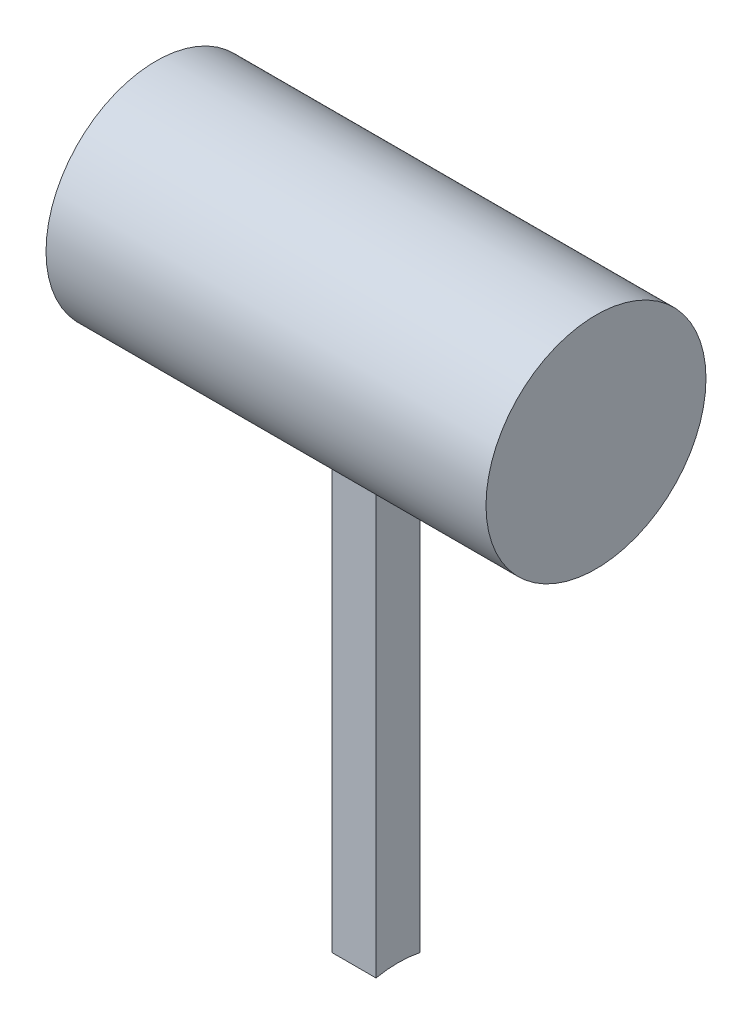
ISO-10303-21;
HEADER;
FILE_DESCRIPTION(('STEP AP214'),'2;1');
FILE_NAME('part.step','',(''),(''),'','','');
FILE_SCHEMA(('AUTOMOTIVE_DESIGN { 1 0 10303 214 1 1 1 1 }'));
ENDSEC;
DATA;
#1=APPLICATION_CONTEXT('core data for automotive mechanical design processes');
#2=APPLICATION_PROTOCOL_DEFINITION('international standard','automotive_design',2000,#1);
#3=PRODUCT_CONTEXT('',#1,'mechanical');
#4=PRODUCT('Part','Part','',(#3));
#5=PRODUCT_RELATED_PRODUCT_CATEGORY('part','',(#4));
#6=PRODUCT_DEFINITION_FORMATION('','',#4);
#7=PRODUCT_DEFINITION_CONTEXT('part definition',#1,'design');
#8=PRODUCT_DEFINITION('design','',#6,#7);
#9=PRODUCT_DEFINITION_SHAPE('','',#8);
#10=(LENGTH_UNIT() NAMED_UNIT(*) SI_UNIT(.MILLI.,.METRE.));
#11=(NAMED_UNIT(*) PLANE_ANGLE_UNIT() SI_UNIT($,.RADIAN.));
#12=(NAMED_UNIT(*) SI_UNIT($,.STERADIAN.) SOLID_ANGLE_UNIT());
#13=UNCERTAINTY_MEASURE_WITH_UNIT(LENGTH_MEASURE(1.E-05),#10,'distance_accuracy_value','');
#14=(GEOMETRIC_REPRESENTATION_CONTEXT(3) GLOBAL_UNCERTAINTY_ASSIGNED_CONTEXT((#13)) GLOBAL_UNIT_ASSIGNED_CONTEXT((#10,
#11,#12)) REPRESENTATION_CONTEXT('',''));
#15=CARTESIAN_POINT('',(0.,0.,0.));
#16=DIRECTION('',(0.,0.,1.));
#17=DIRECTION('',(1.,0.,0.));
#18=AXIS2_PLACEMENT_3D('',#15,#16,#17);
#19=CARTESIAN_POINT('',(10.,0.,0.));
#20=DIRECTION('',(-1.,0.,0.));
#21=DIRECTION('',(0.,0.,1.));
#22=AXIS2_PLACEMENT_3D('',#19,#20,#21);
#23=CYLINDRICAL_SURFACE('',#22,5.);
#24=CARTESIAN_POINT('',(-0.999999999999999,0.,0.));
#25=DIRECTION('',(1.,0.,0.));
#26=DIRECTION('',(0.,1.,0.));
#27=AXIS2_PLACEMENT_3D('',#24,#25,#26);
#28=CIRCLE('',#27,5.);
#29=CARTESIAN_POINT('',(-0.999999999999999,-4.89897948556635,1.));
#30=VERTEX_POINT('',#29);
#31=CARTESIAN_POINT('',(-1.,-4.89897948556635,-1.));
#32=VERTEX_POINT('',#31);
#33=EDGE_CURVE('E54',#30,#32,#28,.T.);
#34=ORIENTED_EDGE('',*,*,#33,.F.);
#35=DIRECTION('',(-1.,0.,0.));
#36=VECTOR('',#35,1.);
#37=CARTESIAN_POINT('',(10.,-4.89897948556635,1.));
#38=LINE('',#37,#36);
#39=CARTESIAN_POINT('',(1.,-4.89897948556635,1.));
#40=VERTEX_POINT('',#39);
#41=EDGE_CURVE('E40',#30,#40,#38,.F.);
#42=ORIENTED_EDGE('',*,*,#41,.T.);
#43=CARTESIAN_POINT('',(0.999999999999999,0.,0.));
#44=DIRECTION('',(-1.,0.,0.));
#45=DIRECTION('',(0.,-1.,0.));
#46=AXIS2_PLACEMENT_3D('',#43,#44,#45);
#47=CIRCLE('',#46,5.);
#48=CARTESIAN_POINT('',(1.,-4.89897948556635,-1.));
#49=VERTEX_POINT('',#48);
#50=EDGE_CURVE('E88',#49,#40,#47,.T.);
#51=ORIENTED_EDGE('',*,*,#50,.F.);
#52=DIRECTION('',(-1.,0.,0.));
#53=VECTOR('',#52,1.);
#54=CARTESIAN_POINT('',(10.,-4.89897948556635,-1.));
#55=LINE('',#54,#53);
#56=EDGE_CURVE('E101',#32,#49,#55,.F.);
#57=ORIENTED_EDGE('',*,*,#56,.F.);
#58=EDGE_LOOP('',(#34,#42,#51,#57));
#59=FACE_BOUND('',#58,.T.);
#60=CARTESIAN_POINT('',(10.,0.,0.));
#61=DIRECTION('',(1.,0.,0.));
#62=DIRECTION('',(0.,0.,-1.));
#63=AXIS2_PLACEMENT_3D('',#60,#61,#62);
#64=CIRCLE('',#63,5.);
#65=CARTESIAN_POINT('',(10.,0.,-5.));
#66=VERTEX_POINT('',#65);
#67=EDGE_CURVE('E92',#66,#66,#64,.T.);
#68=ORIENTED_EDGE('',*,*,#67,.F.);
#69=EDGE_LOOP('',(#68));
#70=FACE_BOUND('',#69,.T.);
#71=CARTESIAN_POINT('',(-10.,0.,0.));
#72=DIRECTION('',(1.,0.,0.));
#73=DIRECTION('',(0.,0.,-1.));
#74=AXIS2_PLACEMENT_3D('',#71,#72,#73);
#75=CIRCLE('',#74,5.);
#76=CARTESIAN_POINT('',(-10.,0.,-5.));
#77=VERTEX_POINT('',#76);
#78=EDGE_CURVE('E89',#77,#77,#75,.T.);
#79=ORIENTED_EDGE('',*,*,#78,.T.);
#80=EDGE_LOOP('',(#79));
#81=FACE_BOUND('',#80,.T.);
#82=ADVANCED_FACE('F33',(#59,#70,#81),#23,.T.);
#83=CARTESIAN_POINT('',(10.,0.,0.));
#84=DIRECTION('',(1.,0.,0.));
#85=DIRECTION('',(0.,0.,-1.));
#86=AXIS2_PLACEMENT_3D('',#83,#84,#85);
#87=PLANE('',#86);
#88=ORIENTED_EDGE('',*,*,#67,.T.);
#89=EDGE_LOOP('',(#88));
#90=FACE_BOUND('',#89,.T.);
#91=ADVANCED_FACE('F126',(#90),#87,.T.);
#92=CARTESIAN_POINT('',(-10.,0.,0.));
#93=DIRECTION('',(1.,0.,0.));
#94=DIRECTION('',(0.,0.,-1.));
#95=AXIS2_PLACEMENT_3D('',#92,#93,#94);
#96=PLANE('',#95);
#97=ORIENTED_EDGE('',*,*,#78,.F.);
#98=EDGE_LOOP('',(#97));
#99=FACE_BOUND('',#98,.T.);
#100=ADVANCED_FACE('F122',(#99),#96,.F.);
#101=CARTESIAN_POINT('',(0.,0.,1.));
#102=DIRECTION('',(0.,0.,1.));
#103=DIRECTION('',(1.,0.,0.));
#104=AXIS2_PLACEMENT_3D('',#101,#102,#103);
#105=PLANE('',#104);
#106=DIRECTION('',(1.,0.,0.));
#107=VECTOR('',#106,1.);
#108=CARTESIAN_POINT('',(-10.,-25.1010205144336,1.));
#109=LINE('',#108,#107);
#110=CARTESIAN_POINT('',(1.00000000000001,-25.1010205144336,1.));
#111=VERTEX_POINT('',#110);
#112=CARTESIAN_POINT('',(-0.999999999999996,-25.1010205144336,1.));
#113=VERTEX_POINT('',#112);
#114=EDGE_CURVE('E72',#111,#113,#109,.F.);
#115=ORIENTED_EDGE('',*,*,#114,.F.);
#116=DIRECTION('',(0.,1.,0.));
#117=VECTOR('',#116,1.);
#118=CARTESIAN_POINT('',(1.,0.,1.));
#119=LINE('',#118,#117);
#120=EDGE_CURVE('E80',#111,#40,#119,.T.);
#121=ORIENTED_EDGE('',*,*,#120,.T.);
#122=ORIENTED_EDGE('',*,*,#41,.F.);
#123=DIRECTION('',(0.,-1.,0.));
#124=VECTOR('',#123,1.);
#125=CARTESIAN_POINT('',(-1.,0.,1.));
#126=LINE('',#125,#124);
#127=EDGE_CURVE('E82',#30,#113,#126,.T.);
#128=ORIENTED_EDGE('',*,*,#127,.T.);
#129=EDGE_LOOP('',(#115,#121,#122,#128));
#130=FACE_BOUND('',#129,.T.);
#131=ADVANCED_FACE('F79',(#130),#105,.T.);
#132=CARTESIAN_POINT('',(0.,0.,-1.));
#133=DIRECTION('',(0.,0.,1.));
#134=DIRECTION('',(1.,0.,0.));
#135=AXIS2_PLACEMENT_3D('',#132,#133,#134);
#136=PLANE('',#135);
#137=DIRECTION('',(0.,1.,0.));
#138=VECTOR('',#137,1.);
#139=CARTESIAN_POINT('',(1.,0.,-1.));
#140=LINE('',#139,#138);
#141=CARTESIAN_POINT('',(1.00000000000001,-25.1010205144336,-1.));
#142=VERTEX_POINT('',#141);
#143=EDGE_CURVE('E94',#142,#49,#140,.T.);
#144=ORIENTED_EDGE('',*,*,#143,.F.);
#145=DIRECTION('',(1.,0.,0.));
#146=VECTOR('',#145,1.);
#147=CARTESIAN_POINT('',(-10.,-25.1010205144336,-1.));
#148=LINE('',#147,#146);
#149=CARTESIAN_POINT('',(-0.999999999999996,-25.1010205144336,-1.));
#150=VERTEX_POINT('',#149);
#151=EDGE_CURVE('E47',#142,#150,#148,.F.);
#152=ORIENTED_EDGE('',*,*,#151,.T.);
#153=DIRECTION('',(0.,-1.,0.));
#154=VECTOR('',#153,1.);
#155=CARTESIAN_POINT('',(-1.,0.,-1.));
#156=LINE('',#155,#154);
#157=EDGE_CURVE('E83',#32,#150,#156,.T.);
#158=ORIENTED_EDGE('',*,*,#157,.F.);
#159=ORIENTED_EDGE('',*,*,#56,.T.);
#160=EDGE_LOOP('',(#144,#152,#158,#159));
#161=FACE_BOUND('',#160,.T.);
#162=ADVANCED_FACE('F114',(#161),#136,.F.);
#163=CARTESIAN_POINT('',(-1.,0.,1.));
#164=DIRECTION('',(1.,0.,0.));
#165=DIRECTION('',(0.,1.,0.));
#166=AXIS2_PLACEMENT_3D('',#163,#164,#165);
#167=PLANE('',#166);
#168=ORIENTED_EDGE('',*,*,#157,.T.);
#169=CARTESIAN_POINT('',(-0.999999999999996,-30.,0.));
#170=DIRECTION('',(1.,0.,0.));
#171=DIRECTION('',(0.,1.,0.));
#172=AXIS2_PLACEMENT_3D('',#169,#170,#171);
#173=CIRCLE('',#172,5.);
#174=EDGE_CURVE('E110',#150,#113,#173,.T.);
#175=ORIENTED_EDGE('',*,*,#174,.T.);
#176=ORIENTED_EDGE('',*,*,#127,.F.);
#177=ORIENTED_EDGE('',*,*,#33,.T.);
#178=EDGE_LOOP('',(#168,#175,#176,#177));
#179=FACE_BOUND('',#178,.T.);
#180=ADVANCED_FACE('F108',(#179),#167,.F.);
#181=CARTESIAN_POINT('',(1.,0.,1.));
#182=DIRECTION('',(-1.,0.,0.));
#183=DIRECTION('',(0.,-1.,0.));
#184=AXIS2_PLACEMENT_3D('',#181,#182,#183);
#185=PLANE('',#184);
#186=ORIENTED_EDGE('',*,*,#120,.F.);
#187=CARTESIAN_POINT('',(1.00000000000001,-30.,0.));
#188=DIRECTION('',(-1.,0.,0.));
#189=DIRECTION('',(0.,-1.,0.));
#190=AXIS2_PLACEMENT_3D('',#187,#188,#189);
#191=CIRCLE('',#190,5.);
#192=EDGE_CURVE('E11',#111,#142,#191,.T.);
#193=ORIENTED_EDGE('',*,*,#192,.T.);
#194=ORIENTED_EDGE('',*,*,#143,.T.);
#195=ORIENTED_EDGE('',*,*,#50,.T.);
#196=EDGE_LOOP('',(#186,#193,#194,#195));
#197=FACE_BOUND('',#196,.T.);
#198=ADVANCED_FACE('F86',(#197),#185,.F.);
#199=CARTESIAN_POINT('',(-10.,-30.,0.));
#200=DIRECTION('',(1.,0.,0.));
#201=DIRECTION('',(0.,1.,0.));
#202=AXIS2_PLACEMENT_3D('',#199,#200,#201);
#203=CYLINDRICAL_SURFACE('',#202,5.);
#204=ORIENTED_EDGE('',*,*,#114,.T.);
#205=ORIENTED_EDGE('',*,*,#174,.F.);
#206=ORIENTED_EDGE('',*,*,#151,.F.);
#207=ORIENTED_EDGE('',*,*,#192,.F.);
#208=EDGE_LOOP('',(#204,#205,#206,#207));
#209=FACE_BOUND('',#208,.T.);
#210=ADVANCED_FACE('F71',(#209),#203,.F.);
#211=CLOSED_SHELL('',(#82,#91,#100,#131,#162,#180,#198,#210));
#212=MANIFOLD_SOLID_BREP('B2',#211);
#213=ADVANCED_BREP_SHAPE_REPRESENTATION('',(#18,#212),#14);
#214=SHAPE_DEFINITION_REPRESENTATION(#9,#213);
ENDSEC;
END-ISO-10303-21;
